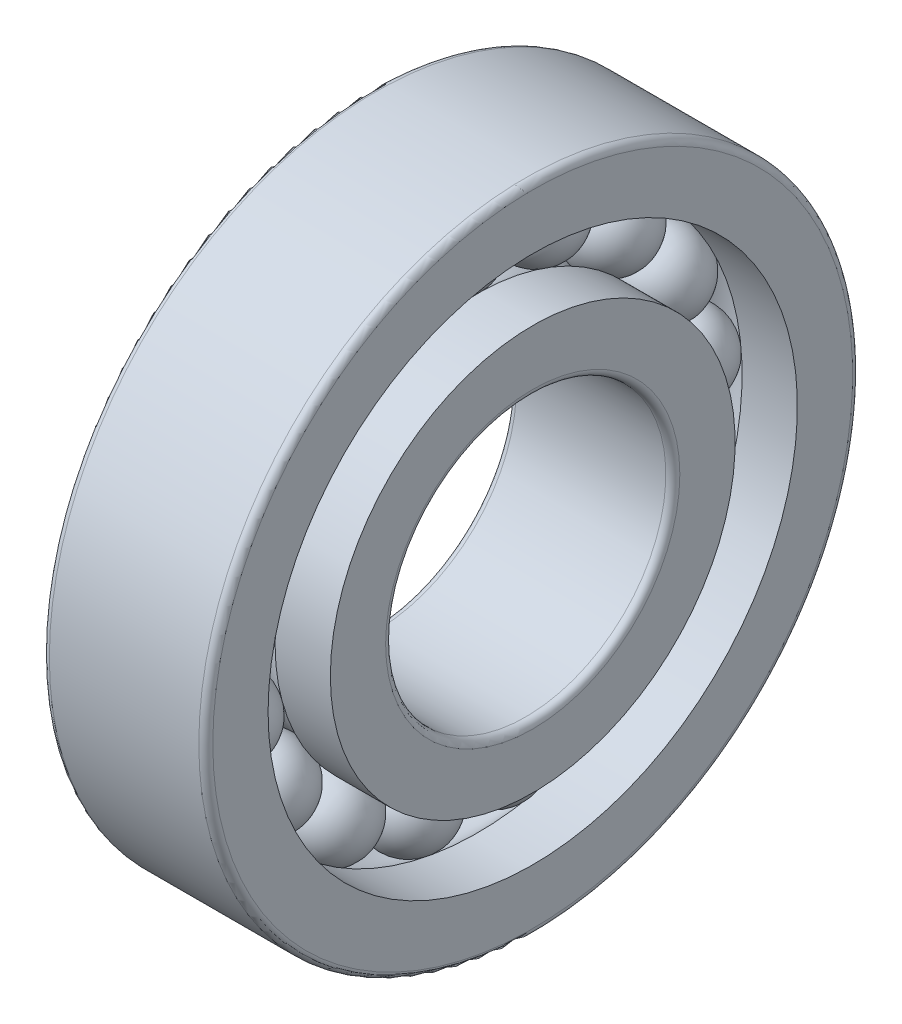
ISO-10303-21;
HEADER;
FILE_DESCRIPTION(('STEP AP214'),'2;1');
FILE_NAME('part.step','',(''),(''),'','','');
FILE_SCHEMA(('AUTOMOTIVE_DESIGN { 1 0 10303 214 1 1 1 1 }'));
ENDSEC;
DATA;
#1=APPLICATION_CONTEXT('core data for automotive mechanical design processes');
#2=APPLICATION_PROTOCOL_DEFINITION('international standard','automotive_design',2000,#1);
#3=PRODUCT_CONTEXT('',#1,'mechanical');
#4=PRODUCT('Part','Part','',(#3));
#5=PRODUCT_RELATED_PRODUCT_CATEGORY('part','',(#4));
#6=PRODUCT_DEFINITION_FORMATION('','',#4);
#7=PRODUCT_DEFINITION_CONTEXT('part definition',#1,'design');
#8=PRODUCT_DEFINITION('design','',#6,#7);
#9=PRODUCT_DEFINITION_SHAPE('','',#8);
#10=(LENGTH_UNIT() NAMED_UNIT(*) SI_UNIT(.MILLI.,.METRE.));
#11=(NAMED_UNIT(*) PLANE_ANGLE_UNIT() SI_UNIT($,.RADIAN.));
#12=(NAMED_UNIT(*) SI_UNIT($,.STERADIAN.) SOLID_ANGLE_UNIT());
#13=UNCERTAINTY_MEASURE_WITH_UNIT(LENGTH_MEASURE(1.E-05),#10,'distance_accuracy_value','');
#14=(GEOMETRIC_REPRESENTATION_CONTEXT(3) GLOBAL_UNCERTAINTY_ASSIGNED_CONTEXT((#13)) GLOBAL_UNIT_ASSIGNED_CONTEXT((#10,
#11,#12)) REPRESENTATION_CONTEXT('',''));
#15=CARTESIAN_POINT('',(0.,0.,0.));
#16=DIRECTION('',(0.,0.,1.));
#17=DIRECTION('',(1.,0.,0.));
#18=AXIS2_PLACEMENT_3D('',#15,#16,#17);
#19=CARTESIAN_POINT('',(0.,9.32472229404361,3.61241666187141));
#20=DIRECTION('',(-1.,0.,0.));
#21=DIRECTION('',(0.,-0.932472229404363,-0.361241666187134));
#22=AXIS2_PLACEMENT_3D('',#19,#20,#21);
#23=SPHERICAL_SURFACE('',#22,1.75);
#24=CARTESIAN_POINT('',(-1.75,9.32472229404361,3.61241666187141));
#25=VERTEX_POINT('',#24);
#26=VERTEX_LOOP('',#25);
#27=FACE_BOUND('',#26,.T.);
#28=ADVANCED_FACE('F47',(#27),#23,.T.);
#29=CLOSED_SHELL('',(#28));
#30=MANIFOLD_SOLID_BREP('B2',#29);
#31=CARTESIAN_POINT('',(0.,7.39008917220668,6.73695643646549));
#32=DIRECTION('',(-1.,0.,0.));
#33=DIRECTION('',(0.,-0.739008917220672,-0.673695643646543));
#34=AXIS2_PLACEMENT_3D('',#31,#32,#33);
#35=SPHERICAL_SURFACE('',#34,1.75);
#36=CARTESIAN_POINT('',(-1.75,7.39008917220668,6.73695643646549));
#37=VERTEX_POINT('',#36);
#38=VERTEX_LOOP('',#37);
#39=FACE_BOUND('',#38,.T.);
#40=ADVANCED_FACE('F69',(#39),#35,.T.);
#41=CLOSED_SHELL('',(#40));
#42=MANIFOLD_SOLID_BREP('B6',#41);
#43=CARTESIAN_POINT('',(0.,4.45738355776549,8.95163291355058));
#44=DIRECTION('',(-1.,0.,0.));
#45=DIRECTION('',(0.,-0.445738355776555,-0.895163291355054));
#46=AXIS2_PLACEMENT_3D('',#43,#44,#45);
#47=SPHERICAL_SURFACE('',#46,1.75);
#48=CARTESIAN_POINT('',(-1.75,4.45738355776549,8.95163291355058));
#49=VERTEX_POINT('',#48);
#50=VERTEX_LOOP('',#49);
#51=FACE_BOUND('',#50,.T.);
#52=ADVANCED_FACE('F91',(#51),#47,.T.);
#53=CLOSED_SHELL('',(#52));
#54=MANIFOLD_SOLID_BREP('B43',#53);
#55=CARTESIAN_POINT('',(0.,0.922683594633131,9.95734176295034));
#56=DIRECTION('',(-1.,0.,0.));
#57=DIRECTION('',(0.,-0.09226835946332,-0.995734176295033));
#58=AXIS2_PLACEMENT_3D('',#55,#56,#57);
#59=SPHERICAL_SURFACE('',#58,1.75);
#60=CARTESIAN_POINT('',(-1.75,0.922683594633131,9.95734176295034));
#61=VERTEX_POINT('',#60);
#62=VERTEX_LOOP('',#61);
#63=FACE_BOUND('',#62,.T.);
#64=ADVANCED_FACE('F113',(#63),#59,.T.);
#65=CLOSED_SHELL('',(#64));
#66=MANIFOLD_SOLID_BREP('B65',#65);
#67=CARTESIAN_POINT('',(0.,-2.73662990072073,9.61825643172823));
#68=DIRECTION('',(-1.,0.,0.));
#69=DIRECTION('',(0.,0.273662990072066,-0.961825643172824));
#70=AXIS2_PLACEMENT_3D('',#67,#68,#69);
#71=SPHERICAL_SURFACE('',#70,1.75);
#72=CARTESIAN_POINT('',(-1.75,-2.73662990072073,9.61825643172823));
#73=VERTEX_POINT('',#72);
#74=VERTEX_LOOP('',#73);
#75=FACE_BOUND('',#74,.T.);
#76=ADVANCED_FACE('F135',(#75),#71,.T.);
#77=CLOSED_SHELL('',(#76));
#78=MANIFOLD_SOLID_BREP('B87',#77);
#79=CARTESIAN_POINT('',(0.,-6.0263463637925,7.98017227280245));
#80=DIRECTION('',(-1.,0.,0.));
#81=DIRECTION('',(0.,0.602634636379244,-0.798017227280249));
#82=AXIS2_PLACEMENT_3D('',#79,#80,#81);
#83=SPHERICAL_SURFACE('',#82,1.75);
#84=CARTESIAN_POINT('',(-1.75,-6.0263463637925,7.98017227280245));
#85=VERTEX_POINT('',#84);
#86=VERTEX_LOOP('',#85);
#87=FACE_BOUND('',#86,.T.);
#88=ADVANCED_FACE('F157',(#87),#83,.T.);
#89=CLOSED_SHELL('',(#88));
#90=MANIFOLD_SOLID_BREP('B109',#89);
#91=CARTESIAN_POINT('',(0.,-8.50217135729611,5.26432162877363));
#92=DIRECTION('',(-1.,0.,0.));
#93=DIRECTION('',(0.,0.850217135729606,-0.526432162877369));
#94=AXIS2_PLACEMENT_3D('',#91,#92,#93);
#95=SPHERICAL_SURFACE('',#94,1.75);
#96=CARTESIAN_POINT('',(-1.75,-8.50217135729611,5.26432162877363));
#97=VERTEX_POINT('',#96);
#98=VERTEX_LOOP('',#97);
#99=FACE_BOUND('',#98,.T.);
#100=ADVANCED_FACE('F179',(#99),#95,.T.);
#101=CLOSED_SHELL('',(#100));
#102=MANIFOLD_SOLID_BREP('B131',#101);
#103=CARTESIAN_POINT('',(0.,-9.82973099683901,1.83749517816578));
#104=DIRECTION('',(-1.,0.,0.));
#105=DIRECTION('',(0.,0.982973099683899,-0.183749517816584));
#106=AXIS2_PLACEMENT_3D('',#103,#104,#105);
#107=SPHERICAL_SURFACE('',#106,1.75);
#108=CARTESIAN_POINT('',(-1.75,-9.82973099683901,1.83749517816578));
#109=VERTEX_POINT('',#108);
#110=VERTEX_LOOP('',#109);
#111=FACE_BOUND('',#110,.T.);
#112=ADVANCED_FACE('F201',(#111),#107,.T.);
#113=CLOSED_SHELL('',(#112));
#114=MANIFOLD_SOLID_BREP('B153',#113);
#115=CARTESIAN_POINT('',(0.,-9.82973099683904,-1.83749517816564));
#116=DIRECTION('',(-1.,0.,0.));
#117=DIRECTION('',(0.,0.982973099683904,0.183749517816557));
#118=AXIS2_PLACEMENT_3D('',#115,#116,#117);
#119=SPHERICAL_SURFACE('',#118,1.75);
#120=CARTESIAN_POINT('',(-1.75,-9.82973099683904,-1.83749517816564));
#121=VERTEX_POINT('',#120);
#122=VERTEX_LOOP('',#121);
#123=FACE_BOUND('',#122,.T.);
#124=ADVANCED_FACE('F223',(#123),#119,.T.);
#125=CLOSED_SHELL('',(#124));
#126=MANIFOLD_SOLID_BREP('B175',#125);
#127=CARTESIAN_POINT('',(0.,-8.50217135729618,-5.26432162877351));
#128=DIRECTION('',(-1.,0.,0.));
#129=DIRECTION('',(0.,0.850217135729621,0.526432162877345));
#130=AXIS2_PLACEMENT_3D('',#127,#128,#129);
#131=SPHERICAL_SURFACE('',#130,1.75);
#132=CARTESIAN_POINT('',(-1.75,-8.50217135729618,-5.26432162877351));
#133=VERTEX_POINT('',#132);
#134=VERTEX_LOOP('',#133);
#135=FACE_BOUND('',#134,.T.);
#136=ADVANCED_FACE('F245',(#135),#131,.T.);
#137=CLOSED_SHELL('',(#136));
#138=MANIFOLD_SOLID_BREP('B197',#137);
#139=CARTESIAN_POINT('',(0.,-6.02634636379261,-7.98017227280237));
#140=DIRECTION('',(-1.,0.,0.));
#141=DIRECTION('',(0.,0.602634636379266,0.798017227280232));
#142=AXIS2_PLACEMENT_3D('',#139,#140,#141);
#143=SPHERICAL_SURFACE('',#142,1.75);
#144=CARTESIAN_POINT('',(-1.75,-6.02634636379261,-7.98017227280237));
#145=VERTEX_POINT('',#144);
#146=VERTEX_LOOP('',#145);
#147=FACE_BOUND('',#146,.T.);
#148=ADVANCED_FACE('F267',(#147),#143,.T.);
#149=CLOSED_SHELL('',(#148));
#150=MANIFOLD_SOLID_BREP('B219',#149);
#151=CARTESIAN_POINT('',(0.,-2.73662990072087,-9.61825643172819));
#152=DIRECTION('',(-1.,0.,0.));
#153=DIRECTION('',(0.,0.273662990072093,0.961825643172816));
#154=AXIS2_PLACEMENT_3D('',#151,#152,#153);
#155=SPHERICAL_SURFACE('',#154,1.75);
#156=CARTESIAN_POINT('',(-1.75,-2.73662990072087,-9.61825643172819));
#157=VERTEX_POINT('',#156);
#158=VERTEX_LOOP('',#157);
#159=FACE_BOUND('',#158,.T.);
#160=ADVANCED_FACE('F289',(#159),#155,.T.);
#161=CLOSED_SHELL('',(#160));
#162=MANIFOLD_SOLID_BREP('B241',#161);
#163=CARTESIAN_POINT('',(0.,0.922683594632988,-9.95734176295036));
#164=DIRECTION('',(-1.,0.,0.));
#165=DIRECTION('',(0.,-0.0922683594632918,0.995734176295036));
#166=AXIS2_PLACEMENT_3D('',#163,#164,#165);
#167=SPHERICAL_SURFACE('',#166,1.75);
#168=CARTESIAN_POINT('',(-1.75,0.922683594632988,-9.95734176295036));
#169=VERTEX_POINT('',#168);
#170=VERTEX_LOOP('',#169);
#171=FACE_BOUND('',#170,.T.);
#172=ADVANCED_FACE('F311',(#171),#167,.T.);
#173=CLOSED_SHELL('',(#172));
#174=MANIFOLD_SOLID_BREP('B263',#173);
#175=CARTESIAN_POINT('',(0.,4.45738355776536,-8.95163291355064));
#176=DIRECTION('',(-1.,0.,0.));
#177=DIRECTION('',(0.,-0.44573835577653,0.895163291355067));
#178=AXIS2_PLACEMENT_3D('',#175,#176,#177);
#179=SPHERICAL_SURFACE('',#178,1.75);
#180=CARTESIAN_POINT('',(-1.75,4.45738355776536,-8.95163291355064));
#181=VERTEX_POINT('',#180);
#182=VERTEX_LOOP('',#181);
#183=FACE_BOUND('',#182,.T.);
#184=ADVANCED_FACE('F333',(#183),#179,.T.);
#185=CLOSED_SHELL('',(#184));
#186=MANIFOLD_SOLID_BREP('B285',#185);
#187=CARTESIAN_POINT('',(0.,7.39008917220659,-6.73695643646559));
#188=DIRECTION('',(-1.,0.,0.));
#189=DIRECTION('',(0.,-0.739008917220653,0.673695643646564));
#190=AXIS2_PLACEMENT_3D('',#187,#188,#189);
#191=SPHERICAL_SURFACE('',#190,1.75);
#192=CARTESIAN_POINT('',(-1.75,7.39008917220659,-6.73695643646559));
#193=VERTEX_POINT('',#192);
#194=VERTEX_LOOP('',#193);
#195=FACE_BOUND('',#194,.T.);
#196=ADVANCED_FACE('F355',(#195),#191,.T.);
#197=CLOSED_SHELL('',(#196));
#198=MANIFOLD_SOLID_BREP('B307',#197);
#199=CARTESIAN_POINT('',(0.,9.32472229404356,-3.61241666187154));
#200=DIRECTION('',(-1.,0.,0.));
#201=DIRECTION('',(0.,-0.932472229404353,0.36124166618716));
#202=AXIS2_PLACEMENT_3D('',#199,#200,#201);
#203=SPHERICAL_SURFACE('',#202,1.75);
#204=CARTESIAN_POINT('',(-1.75,9.32472229404356,-3.61241666187154));
#205=VERTEX_POINT('',#204);
#206=VERTEX_LOOP('',#205);
#207=FACE_BOUND('',#206,.T.);
#208=ADVANCED_FACE('F379',(#207),#203,.T.);
#209=CLOSED_SHELL('',(#208));
#210=MANIFOLD_SOLID_BREP('B329',#209);
#211=CARTESIAN_POINT('',(-3.05000000000011,0.,0.));
#212=DIRECTION('',(1.,0.,0.));
#213=DIRECTION('',(0.,0.,-1.));
#214=AXIS2_PLACEMENT_3D('',#211,#212,#213);
#215=CONICAL_SURFACE('',#214,11.6333333333334,0.785398163397541);
#216=CARTESIAN_POINT('',(-3.35000000000005,0.,0.));
#217=DIRECTION('',(-1.,0.,0.));
#218=DIRECTION('',(0.,0.,1.));
#219=AXIS2_PLACEMENT_3D('',#216,#217,#218);
#220=CIRCLE('',#219,11.3333333333334);
#221=CARTESIAN_POINT('',(-3.35000000000005,0.,11.3333333333334));
#222=VERTEX_POINT('',#221);
#223=EDGE_CURVE('E378',#222,#222,#220,.T.);
#224=ORIENTED_EDGE('',*,*,#223,.F.);
#225=EDGE_LOOP('',(#224));
#226=FACE_BOUND('',#225,.T.);
#227=CARTESIAN_POINT('',(-3.05000000000011,0.,0.));
#228=DIRECTION('',(-1.,0.,0.));
#229=DIRECTION('',(0.,0.,1.));
#230=AXIS2_PLACEMENT_3D('',#227,#228,#229);
#231=CIRCLE('',#230,11.6333333333334);
#232=CARTESIAN_POINT('',(-3.05000000000011,0.,11.6333333333334));
#233=VERTEX_POINT('',#232);
#234=EDGE_CURVE('E435',#233,#233,#231,.T.);
#235=ORIENTED_EDGE('',*,*,#234,.T.);
#236=EDGE_LOOP('',(#235));
#237=FACE_BOUND('',#236,.T.);
#238=ADVANCED_FACE('F401',(#226,#237),#215,.T.);
#239=CARTESIAN_POINT('',(-3.35000000000005,-11.3333333333334,0.));
#240=DIRECTION('',(1.,0.,0.));
#241=DIRECTION('',(0.,0.,-1.));
#242=AXIS2_PLACEMENT_3D('',#239,#240,#241);
#243=PLANE('',#242);
#244=CARTESIAN_POINT('',(-3.35000000000005,0.,0.));
#245=DIRECTION('',(-1.,0.,0.));
#246=DIRECTION('',(0.,0.,1.));
#247=AXIS2_PLACEMENT_3D('',#244,#245,#246);
#248=CIRCLE('',#247,8.66666666666666);
#249=CARTESIAN_POINT('',(-3.35000000000005,0.,8.66666666666666));
#250=VERTEX_POINT('',#249);
#251=EDGE_CURVE('E407',#250,#250,#248,.T.);
#252=ORIENTED_EDGE('',*,*,#251,.F.);
#253=EDGE_LOOP('',(#252));
#254=FACE_BOUND('',#253,.T.);
#255=ORIENTED_EDGE('',*,*,#223,.T.);
#256=EDGE_LOOP('',(#255));
#257=FACE_BOUND('',#256,.T.);
#258=ADVANCED_FACE('F484',(#254,#257),#243,.F.);
#259=CARTESIAN_POINT('',(-3.35000000000005,0.,0.));
#260=DIRECTION('',(-1.,0.,0.));
#261=DIRECTION('',(0.,0.,1.));
#262=AXIS2_PLACEMENT_3D('',#259,#260,#261);
#263=CONICAL_SURFACE('',#262,8.66666666666666,0.785398163397454);
#264=CARTESIAN_POINT('',(-3.05000000000006,0.,0.));
#265=DIRECTION('',(-1.,0.,0.));
#266=DIRECTION('',(0.,0.,1.));
#267=AXIS2_PLACEMENT_3D('',#264,#265,#266);
#268=CIRCLE('',#267,8.36666666666666);
#269=CARTESIAN_POINT('',(-3.05000000000006,0.,8.36666666666666));
#270=VERTEX_POINT('',#269);
#271=EDGE_CURVE('E411',#270,#270,#268,.T.);
#272=ORIENTED_EDGE('',*,*,#271,.F.);
#273=EDGE_LOOP('',(#272));
#274=FACE_BOUND('',#273,.T.);
#275=ORIENTED_EDGE('',*,*,#251,.T.);
#276=EDGE_LOOP('',(#275));
#277=FACE_BOUND('',#276,.T.);
#278=ADVANCED_FACE('F479',(#274,#277),#263,.F.);
#279=CARTESIAN_POINT('',(-19.9270921924268,0.,0.));
#280=DIRECTION('',(-1.,0.,0.));
#281=DIRECTION('',(0.,0.,1.));
#282=AXIS2_PLACEMENT_3D('',#279,#280,#281);
#283=CYLINDRICAL_SURFACE('',#282,8.36666666666665);
#284=CARTESIAN_POINT('',(-2.75000000000011,0.,0.));
#285=DIRECTION('',(-1.,0.,0.));
#286=DIRECTION('',(0.,0.,1.));
#287=AXIS2_PLACEMENT_3D('',#284,#285,#286);
#288=CIRCLE('',#287,8.36666666666665);
#289=CARTESIAN_POINT('',(-2.75000000000011,0.,8.36666666666665));
#290=VERTEX_POINT('',#289);
#291=EDGE_CURVE('E415',#290,#290,#288,.T.);
#292=ORIENTED_EDGE('',*,*,#291,.F.);
#293=EDGE_LOOP('',(#292));
#294=FACE_BOUND('',#293,.T.);
#295=ORIENTED_EDGE('',*,*,#271,.T.);
#296=EDGE_LOOP('',(#295));
#297=FACE_BOUND('',#296,.T.);
#298=ADVANCED_FACE('F473',(#294,#297),#283,.F.);
#299=CARTESIAN_POINT('',(-2.75000000000011,-8.66666666666666,0.));
#300=DIRECTION('',(-1.,0.,0.));
#301=DIRECTION('',(0.,0.,1.));
#302=AXIS2_PLACEMENT_3D('',#299,#300,#301);
#303=PLANE('',#302);
#304=CARTESIAN_POINT('',(-2.75000000000011,0.,0.));
#305=DIRECTION('',(-1.,0.,0.));
#306=DIRECTION('',(0.,0.,1.));
#307=AXIS2_PLACEMENT_3D('',#304,#305,#306);
#308=CIRCLE('',#307,8.66666666666666);
#309=CARTESIAN_POINT('',(-2.75000000000011,0.,8.66666666666666));
#310=VERTEX_POINT('',#309);
#311=EDGE_CURVE('E420',#310,#310,#308,.T.);
#312=ORIENTED_EDGE('',*,*,#311,.F.);
#313=EDGE_LOOP('',(#312));
#314=FACE_BOUND('',#313,.T.);
#315=ORIENTED_EDGE('',*,*,#291,.T.);
#316=EDGE_LOOP('',(#315));
#317=FACE_BOUND('',#316,.T.);
#318=ADVANCED_FACE('F467',(#314,#317),#303,.F.);
#319=CARTESIAN_POINT('',(-2.75000000000011,0.,0.));
#320=DIRECTION('',(-1.,0.,0.));
#321=DIRECTION('',(0.,0.,1.));
#322=AXIS2_PLACEMENT_3D('',#319,#320,#321);
#323=CONICAL_SURFACE('',#322,8.66666666666666,0.785398163397437);
#324=CARTESIAN_POINT('',(-3.05000000000004,0.,0.));
#325=DIRECTION('',(-1.,0.,0.));
#326=DIRECTION('',(0.,0.,1.));
#327=AXIS2_PLACEMENT_3D('',#324,#325,#326);
#328=CIRCLE('',#327,8.96666666666658);
#329=CARTESIAN_POINT('',(-3.05000000000004,0.,8.96666666666658));
#330=VERTEX_POINT('',#329);
#331=EDGE_CURVE('E423',#330,#330,#328,.T.);
#332=ORIENTED_EDGE('',*,*,#331,.F.);
#333=EDGE_LOOP('',(#332));
#334=FACE_BOUND('',#333,.T.);
#335=ORIENTED_EDGE('',*,*,#311,.T.);
#336=EDGE_LOOP('',(#335));
#337=FACE_BOUND('',#336,.T.);
#338=ADVANCED_FACE('F461',(#334,#337),#323,.T.);
#339=CARTESIAN_POINT('',(-3.05000000000004,-11.0333333333334,0.));
#340=DIRECTION('',(-1.,0.,0.));
#341=DIRECTION('',(0.,0.,1.));
#342=AXIS2_PLACEMENT_3D('',#339,#340,#341);
#343=PLANE('',#342);
#344=CARTESIAN_POINT('',(-3.05000000000004,0.,0.));
#345=DIRECTION('',(-1.,0.,0.));
#346=DIRECTION('',(0.,0.,1.));
#347=AXIS2_PLACEMENT_3D('',#344,#345,#346);
#348=CIRCLE('',#347,11.0333333333334);
#349=CARTESIAN_POINT('',(-3.05000000000004,0.,11.0333333333334));
#350=VERTEX_POINT('',#349);
#351=EDGE_CURVE('E426',#350,#350,#348,.T.);
#352=ORIENTED_EDGE('',*,*,#351,.F.);
#353=EDGE_LOOP('',(#352));
#354=FACE_BOUND('',#353,.T.);
#355=ORIENTED_EDGE('',*,*,#331,.T.);
#356=EDGE_LOOP('',(#355));
#357=FACE_BOUND('',#356,.T.);
#358=ADVANCED_FACE('F455',(#354,#357),#343,.F.);
#359=CARTESIAN_POINT('',(-3.05000000000004,0.,0.));
#360=DIRECTION('',(1.,0.,0.));
#361=DIRECTION('',(0.,0.,-1.));
#362=AXIS2_PLACEMENT_3D('',#359,#360,#361);
#363=CONICAL_SURFACE('',#362,11.0333333333334,0.78539816339746);
#364=CARTESIAN_POINT('',(-2.75000000000011,0.,0.));
#365=DIRECTION('',(-1.,0.,0.));
#366=DIRECTION('',(0.,0.,1.));
#367=AXIS2_PLACEMENT_3D('',#364,#365,#366);
#368=CIRCLE('',#367,11.3333333333334);
#369=CARTESIAN_POINT('',(-2.75000000000011,0.,11.3333333333334));
#370=VERTEX_POINT('',#369);
#371=EDGE_CURVE('E429',#370,#370,#368,.T.);
#372=ORIENTED_EDGE('',*,*,#371,.F.);
#373=EDGE_LOOP('',(#372));
#374=FACE_BOUND('',#373,.T.);
#375=ORIENTED_EDGE('',*,*,#351,.T.);
#376=EDGE_LOOP('',(#375));
#377=FACE_BOUND('',#376,.T.);
#378=ADVANCED_FACE('F449',(#374,#377),#363,.F.);
#379=CARTESIAN_POINT('',(-2.75000000000011,-11.6333333333334,0.));
#380=DIRECTION('',(-1.,0.,0.));
#381=DIRECTION('',(0.,0.,1.));
#382=AXIS2_PLACEMENT_3D('',#379,#380,#381);
#383=PLANE('',#382);
#384=CARTESIAN_POINT('',(-2.75000000000011,0.,0.));
#385=DIRECTION('',(-1.,0.,0.));
#386=DIRECTION('',(0.,0.,1.));
#387=AXIS2_PLACEMENT_3D('',#384,#385,#386);
#388=CIRCLE('',#387,11.6333333333334);
#389=CARTESIAN_POINT('',(-2.75000000000011,0.,11.6333333333334));
#390=VERTEX_POINT('',#389);
#391=EDGE_CURVE('E432',#390,#390,#388,.T.);
#392=ORIENTED_EDGE('',*,*,#391,.F.);
#393=EDGE_LOOP('',(#392));
#394=FACE_BOUND('',#393,.T.);
#395=ORIENTED_EDGE('',*,*,#371,.T.);
#396=EDGE_LOOP('',(#395));
#397=FACE_BOUND('',#396,.T.);
#398=ADVANCED_FACE('F443',(#394,#397),#383,.F.);
#399=CARTESIAN_POINT('',(-19.9270921924268,0.,0.));
#400=DIRECTION('',(-1.,0.,0.));
#401=DIRECTION('',(0.,0.,1.));
#402=AXIS2_PLACEMENT_3D('',#399,#400,#401);
#403=CYLINDRICAL_SURFACE('',#402,11.6333333333334);
#404=ORIENTED_EDGE('',*,*,#234,.F.);
#405=EDGE_LOOP('',(#404));
#406=FACE_BOUND('',#405,.T.);
#407=ORIENTED_EDGE('',*,*,#391,.T.);
#408=EDGE_LOOP('',(#407));
#409=FACE_BOUND('',#408,.T.);
#410=ADVANCED_FACE('F440',(#406,#409),#403,.T.);
#411=CLOSED_SHELL('',(#238,#258,#278,#298,#318,#338,#358,#378,#398,#410));
#412=MANIFOLD_SOLID_BREP('B351',#411);
#413=CARTESIAN_POINT('',(0.,10.,0.));
#414=DIRECTION('',(-1.,0.,0.));
#415=DIRECTION('',(0.,-1.,0.));
#416=AXIS2_PLACEMENT_3D('',#413,#414,#415);
#417=SPHERICAL_SURFACE('',#416,1.75);
#418=CARTESIAN_POINT('',(-1.75,10.,0.));
#419=VERTEX_POINT('',#418);
#420=VERTEX_LOOP('',#419);
#421=FACE_BOUND('',#420,.T.);
#422=ADVANCED_FACE('F600',(#421),#417,.T.);
#423=CLOSED_SHELL('',(#422));
#424=MANIFOLD_SOLID_BREP('B373',#423);
#425=CARTESIAN_POINT('',(-3.50000000000003,6.30000000000001,0.));
#426=DIRECTION('',(1.,0.,0.));
#427=DIRECTION('',(0.,0.,-1.));
#428=AXIS2_PLACEMENT_3D('',#425,#426,#427);
#429=PLANE('',#428);
#430=CARTESIAN_POINT('',(-3.50000000000003,0.,0.));
#431=DIRECTION('',(-1.,0.,0.));
#432=DIRECTION('',(0.,0.,1.));
#433=AXIS2_PLACEMENT_3D('',#430,#431,#432);
#434=CIRCLE('',#433,6.30000000000001);
#435=CARTESIAN_POINT('',(-3.50000000000003,0.,6.30000000000001));
#436=VERTEX_POINT('',#435);
#437=EDGE_CURVE('E599',#436,#436,#434,.T.);
#438=ORIENTED_EDGE('',*,*,#437,.F.);
#439=EDGE_LOOP('',(#438));
#440=FACE_BOUND('',#439,.T.);
#441=CARTESIAN_POINT('',(-3.50000000000003,0.,0.));
#442=DIRECTION('',(-1.,0.,0.));
#443=DIRECTION('',(0.,0.,1.));
#444=AXIS2_PLACEMENT_3D('',#441,#442,#443);
#445=CIRCLE('',#444,8.66666666666666);
#446=CARTESIAN_POINT('',(-3.50000000000003,0.,8.66666666666666));
#447=VERTEX_POINT('',#446);
#448=EDGE_CURVE('E659',#447,#447,#445,.T.);
#449=ORIENTED_EDGE('',*,*,#448,.T.);
#450=EDGE_LOOP('',(#449));
#451=FACE_BOUND('',#450,.T.);
#452=ADVANCED_FACE('F619',(#440,#451),#429,.F.);
#453=CARTESIAN_POINT('',(-3.20000000000003,0.,0.));
#454=DIRECTION('',(-1.,0.,0.));
#455=DIRECTION('',(0.,0.,1.));
#456=AXIS2_PLACEMENT_3D('',#453,#454,#455);
#457=TOROIDAL_SURFACE('',#456,6.30000000000001,0.3);
#458=CARTESIAN_POINT('',(-3.20000000000003,0.,0.));
#459=DIRECTION('',(-1.,0.,0.));
#460=DIRECTION('',(0.,0.,1.));
#461=AXIS2_PLACEMENT_3D('',#458,#459,#460);
#462=CIRCLE('',#461,6.00000000000001);
#463=CARTESIAN_POINT('',(-3.20000000000003,0.,6.00000000000001));
#464=VERTEX_POINT('',#463);
#465=EDGE_CURVE('E625',#464,#464,#462,.T.);
#466=ORIENTED_EDGE('',*,*,#465,.F.);
#467=EDGE_LOOP('',(#466));
#468=FACE_BOUND('',#467,.T.);
#469=ORIENTED_EDGE('',*,*,#437,.T.);
#470=EDGE_LOOP('',(#469));
#471=FACE_BOUND('',#470,.T.);
#472=ADVANCED_FACE('F720',(#468,#471),#457,.T.);
#473=CARTESIAN_POINT('',(-3.5,0.,0.));
#474=DIRECTION('',(-1.,0.,0.));
#475=DIRECTION('',(0.,0.,1.));
#476=AXIS2_PLACEMENT_3D('',#473,#474,#475);
#477=CYLINDRICAL_SURFACE('',#476,6.00000000000001);
#478=CARTESIAN_POINT('',(3.19999999999996,0.,0.));
#479=DIRECTION('',(-1.,0.,0.));
#480=DIRECTION('',(0.,0.,1.));
#481=AXIS2_PLACEMENT_3D('',#478,#479,#480);
#482=CIRCLE('',#481,6.00000000000001);
#483=CARTESIAN_POINT('',(3.19999999999996,0.,6.00000000000001));
#484=VERTEX_POINT('',#483);
#485=EDGE_CURVE('E629',#484,#484,#482,.T.);
#486=ORIENTED_EDGE('',*,*,#485,.F.);
#487=EDGE_LOOP('',(#486));
#488=FACE_BOUND('',#487,.T.);
#489=ORIENTED_EDGE('',*,*,#465,.T.);
#490=EDGE_LOOP('',(#489));
#491=FACE_BOUND('',#490,.T.);
#492=ADVANCED_FACE('F715',(#488,#491),#477,.F.);
#493=CARTESIAN_POINT('',(3.19999999999996,0.,0.));
#494=DIRECTION('',(-1.,0.,0.));
#495=DIRECTION('',(0.,0.,1.));
#496=AXIS2_PLACEMENT_3D('',#493,#494,#495);
#497=TOROIDAL_SURFACE('',#496,6.30000000000001,0.300000000000002);
#498=CARTESIAN_POINT('',(3.49999999999996,0.,0.));
#499=DIRECTION('',(-1.,0.,0.));
#500=DIRECTION('',(0.,0.,1.));
#501=AXIS2_PLACEMENT_3D('',#498,#499,#500);
#502=CIRCLE('',#501,6.3);
#503=CARTESIAN_POINT('',(3.49999999999996,0.,6.3));
#504=VERTEX_POINT('',#503);
#505=EDGE_CURVE('E633',#504,#504,#502,.T.);
#506=ORIENTED_EDGE('',*,*,#505,.F.);
#507=EDGE_LOOP('',(#506));
#508=FACE_BOUND('',#507,.T.);
#509=ORIENTED_EDGE('',*,*,#485,.T.);
#510=EDGE_LOOP('',(#509));
#511=FACE_BOUND('',#510,.T.);
#512=ADVANCED_FACE('F709',(#508,#511),#497,.T.);
#513=CARTESIAN_POINT('',(3.49999999999999,8.66666666666666,0.));
#514=DIRECTION('',(-1.,0.,0.));
#515=DIRECTION('',(0.,0.,1.));
#516=AXIS2_PLACEMENT_3D('',#513,#514,#515);
#517=PLANE('',#516);
#518=CARTESIAN_POINT('',(3.50000000000002,0.,0.));
#519=DIRECTION('',(-1.,0.,0.));
#520=DIRECTION('',(0.,0.,1.));
#521=AXIS2_PLACEMENT_3D('',#518,#519,#520);
#522=CIRCLE('',#521,8.66666666666666);
#523=CARTESIAN_POINT('',(3.50000000000002,0.,8.66666666666666));
#524=VERTEX_POINT('',#523);
#525=EDGE_CURVE('E638',#524,#524,#522,.T.);
#526=ORIENTED_EDGE('',*,*,#525,.F.);
#527=EDGE_LOOP('',(#526));
#528=FACE_BOUND('',#527,.T.);
#529=ORIENTED_EDGE('',*,*,#505,.T.);
#530=EDGE_LOOP('',(#529));
#531=FACE_BOUND('',#530,.T.);
#532=ADVANCED_FACE('F703',(#528,#531),#517,.F.);
#533=CARTESIAN_POINT('',(-3.5,0.,0.));
#534=DIRECTION('',(-1.,0.,0.));
#535=DIRECTION('',(0.,0.,1.));
#536=AXIS2_PLACEMENT_3D('',#533,#534,#535);
#537=CYLINDRICAL_SURFACE('',#536,8.66666666666666);
#538=CARTESIAN_POINT('',(1.13345587572793,0.,0.));
#539=DIRECTION('',(-1.,0.,0.));
#540=DIRECTION('',(0.,0.,1.));
#541=AXIS2_PLACEMENT_3D('',#538,#539,#540);
#542=CIRCLE('',#541,8.66666666666666);
#543=CARTESIAN_POINT('',(1.13345587572793,0.,8.66666666666666));
#544=VERTEX_POINT('',#543);
#545=EDGE_CURVE('E641',#544,#544,#542,.T.);
#546=ORIENTED_EDGE('',*,*,#545,.F.);
#547=EDGE_LOOP('',(#546));
#548=FACE_BOUND('',#547,.T.);
#549=ORIENTED_EDGE('',*,*,#525,.T.);
#550=EDGE_LOOP('',(#549));
#551=FACE_BOUND('',#550,.T.);
#552=ADVANCED_FACE('F697',(#548,#551),#537,.T.);
#553=CARTESIAN_POINT('',(0.,0.,0.));
#554=DIRECTION('',(-1.,0.,0.));
#555=DIRECTION('',(0.,0.,1.));
#556=AXIS2_PLACEMENT_3D('',#553,#554,#555);
#557=TOROIDAL_SURFACE('',#556,10.,1.75);
#558=CARTESIAN_POINT('',(-1.13345587572793,0.,0.));
#559=DIRECTION('',(-1.,0.,0.));
#560=DIRECTION('',(0.,0.,1.));
#561=AXIS2_PLACEMENT_3D('',#558,#559,#560);
#562=CIRCLE('',#561,8.66666666666666);
#563=CARTESIAN_POINT('',(-1.13345587572793,0.,8.66666666666666));
#564=VERTEX_POINT('',#563);
#565=EDGE_CURVE('E644',#564,#564,#562,.T.);
#566=ORIENTED_EDGE('',*,*,#565,.F.);
#567=EDGE_LOOP('',(#566));
#568=FACE_BOUND('',#567,.T.);
#569=ORIENTED_EDGE('',*,*,#545,.T.);
#570=EDGE_LOOP('',(#569));
#571=FACE_BOUND('',#570,.T.);
#572=ADVANCED_FACE('F691',(#568,#571),#557,.F.);
#573=CARTESIAN_POINT('',(-3.5,0.,0.));
#574=DIRECTION('',(-1.,0.,0.));
#575=DIRECTION('',(0.,0.,1.));
#576=AXIS2_PLACEMENT_3D('',#573,#574,#575);
#577=CYLINDRICAL_SURFACE('',#576,8.66666666666666);
#578=CARTESIAN_POINT('',(-2.75000000000011,0.,0.));
#579=DIRECTION('',(-1.,0.,0.));
#580=DIRECTION('',(0.,0.,1.));
#581=AXIS2_PLACEMENT_3D('',#578,#579,#580);
#582=CIRCLE('',#581,8.66666666666666);
#583=CARTESIAN_POINT('',(-2.75000000000011,0.,8.66666666666666));
#584=VERTEX_POINT('',#583);
#585=EDGE_CURVE('E647',#584,#584,#582,.T.);
#586=ORIENTED_EDGE('',*,*,#585,.F.);
#587=EDGE_LOOP('',(#586));
#588=FACE_BOUND('',#587,.T.);
#589=ORIENTED_EDGE('',*,*,#565,.T.);
#590=EDGE_LOOP('',(#589));
#591=FACE_BOUND('',#590,.T.);
#592=ADVANCED_FACE('F685',(#588,#591),#577,.T.);
#593=CARTESIAN_POINT('',(-2.75000000000011,8.66666666666666,0.));
#594=DIRECTION('',(1.,0.,0.));
#595=DIRECTION('',(0.,0.,-1.));
#596=AXIS2_PLACEMENT_3D('',#593,#594,#595);
#597=PLANE('',#596);
#598=CARTESIAN_POINT('',(-2.75000000000011,0.,0.));
#599=DIRECTION('',(-1.,0.,0.));
#600=DIRECTION('',(0.,0.,1.));
#601=AXIS2_PLACEMENT_3D('',#598,#599,#600);
#602=CIRCLE('',#601,8.36666666666665);
#603=CARTESIAN_POINT('',(-2.75000000000011,0.,8.36666666666665));
#604=VERTEX_POINT('',#603);
#605=EDGE_CURVE('E650',#604,#604,#602,.T.);
#606=ORIENTED_EDGE('',*,*,#605,.F.);
#607=EDGE_LOOP('',(#606));
#608=FACE_BOUND('',#607,.T.);
#609=ORIENTED_EDGE('',*,*,#585,.T.);
#610=EDGE_LOOP('',(#609));
#611=FACE_BOUND('',#610,.T.);
#612=ADVANCED_FACE('F679',(#608,#611),#597,.F.);
#613=CARTESIAN_POINT('',(-3.5,0.,0.));
#614=DIRECTION('',(-1.,0.,0.));
#615=DIRECTION('',(0.,0.,1.));
#616=AXIS2_PLACEMENT_3D('',#613,#614,#615);
#617=CYLINDRICAL_SURFACE('',#616,8.36666666666665);
#618=CARTESIAN_POINT('',(-3.05000000000006,0.,0.));
#619=DIRECTION('',(-1.,0.,0.));
#620=DIRECTION('',(0.,0.,1.));
#621=AXIS2_PLACEMENT_3D('',#618,#619,#620);
#622=CIRCLE('',#621,8.36666666666666);
#623=CARTESIAN_POINT('',(-3.05000000000006,0.,8.36666666666666));
#624=VERTEX_POINT('',#623);
#625=EDGE_CURVE('E653',#624,#624,#622,.T.);
#626=ORIENTED_EDGE('',*,*,#625,.F.);
#627=EDGE_LOOP('',(#626));
#628=FACE_BOUND('',#627,.T.);
#629=ORIENTED_EDGE('',*,*,#605,.T.);
#630=EDGE_LOOP('',(#629));
#631=FACE_BOUND('',#630,.T.);
#632=ADVANCED_FACE('F673',(#628,#631),#617,.T.);
#633=CARTESIAN_POINT('',(-3.05000000000006,0.,0.));
#634=DIRECTION('',(-1.,0.,0.));
#635=DIRECTION('',(0.,0.,1.));
#636=AXIS2_PLACEMENT_3D('',#633,#634,#635);
#637=CONICAL_SURFACE('',#636,8.36666666666666,0.785398163397454);
#638=CARTESIAN_POINT('',(-3.35000000000005,0.,0.));
#639=DIRECTION('',(-1.,0.,0.));
#640=DIRECTION('',(0.,0.,1.));
#641=AXIS2_PLACEMENT_3D('',#638,#639,#640);
#642=CIRCLE('',#641,8.66666666666666);
#643=CARTESIAN_POINT('',(-3.35000000000005,0.,8.66666666666666));
#644=VERTEX_POINT('',#643);
#645=EDGE_CURVE('E656',#644,#644,#642,.T.);
#646=ORIENTED_EDGE('',*,*,#645,.F.);
#647=EDGE_LOOP('',(#646));
#648=FACE_BOUND('',#647,.T.);
#649=ORIENTED_EDGE('',*,*,#625,.T.);
#650=EDGE_LOOP('',(#649));
#651=FACE_BOUND('',#650,.T.);
#652=ADVANCED_FACE('F667',(#648,#651),#637,.T.);
#653=CARTESIAN_POINT('',(-3.5,0.,0.));
#654=DIRECTION('',(-1.,0.,0.));
#655=DIRECTION('',(0.,0.,1.));
#656=AXIS2_PLACEMENT_3D('',#653,#654,#655);
#657=CYLINDRICAL_SURFACE('',#656,8.66666666666666);
#658=ORIENTED_EDGE('',*,*,#448,.F.);
#659=EDGE_LOOP('',(#658));
#660=FACE_BOUND('',#659,.T.);
#661=ORIENTED_EDGE('',*,*,#645,.T.);
#662=EDGE_LOOP('',(#661));
#663=FACE_BOUND('',#662,.T.);
#664=ADVANCED_FACE('F664',(#660,#663),#657,.T.);
#665=CLOSED_SHELL('',(#452,#472,#492,#512,#532,#552,#572,#592,#612,#632,#652,#664));
#666=MANIFOLD_SOLID_BREP('B397',#665);
#667=CARTESIAN_POINT('',(-3.20000000000003,0.,0.));
#668=DIRECTION('',(-1.,0.,0.));
#669=DIRECTION('',(0.,0.,1.));
#670=AXIS2_PLACEMENT_3D('',#667,#668,#669);
#671=TOROIDAL_SURFACE('',#670,13.7,0.300000000000005);
#672=CARTESIAN_POINT('',(-3.50000000000003,0.,0.));
#673=DIRECTION('',(-1.,0.,0.));
#674=DIRECTION('',(0.,0.,1.));
#675=AXIS2_PLACEMENT_3D('',#672,#673,#674);
#676=CIRCLE('',#675,13.7);
#677=CARTESIAN_POINT('',(-3.50000000000003,0.,13.7));
#678=VERTEX_POINT('',#677);
#679=EDGE_CURVE('E618',#678,#678,#676,.T.);
#680=ORIENTED_EDGE('',*,*,#679,.F.);
#681=EDGE_LOOP('',(#680));
#682=FACE_BOUND('',#681,.T.);
#683=CARTESIAN_POINT('',(-3.20000000000003,0.,0.));
#684=DIRECTION('',(-1.,0.,0.));
#685=DIRECTION('',(0.,0.,1.));
#686=AXIS2_PLACEMENT_3D('',#683,#684,#685);
#687=CIRCLE('',#686,14.);
#688=CARTESIAN_POINT('',(-3.20000000000003,0.,14.));
#689=VERTEX_POINT('',#688);
#690=EDGE_CURVE('E849',#689,#689,#687,.T.);
#691=ORIENTED_EDGE('',*,*,#690,.T.);
#692=EDGE_LOOP('',(#691));
#693=FACE_BOUND('',#692,.T.);
#694=ADVANCED_FACE('F809',(#682,#693),#671,.T.);
#695=CARTESIAN_POINT('',(-3.50000000000003,13.7,0.));
#696=DIRECTION('',(1.,0.,0.));
#697=DIRECTION('',(0.,0.,-1.));
#698=AXIS2_PLACEMENT_3D('',#695,#696,#697);
#699=PLANE('',#698);
#700=CARTESIAN_POINT('',(-3.50000000000002,0.,0.));
#701=DIRECTION('',(-1.,0.,0.));
#702=DIRECTION('',(0.,0.,1.));
#703=AXIS2_PLACEMENT_3D('',#700,#701,#702);
#704=CIRCLE('',#703,11.3333333333333);
#705=CARTESIAN_POINT('',(-3.50000000000002,0.,11.3333333333333));
#706=VERTEX_POINT('',#705);
#707=EDGE_CURVE('E815',#706,#706,#704,.T.);
#708=ORIENTED_EDGE('',*,*,#707,.F.);
#709=EDGE_LOOP('',(#708));
#710=FACE_BOUND('',#709,.T.);
#711=ORIENTED_EDGE('',*,*,#679,.T.);
#712=EDGE_LOOP('',(#711));
#713=FACE_BOUND('',#712,.T.);
#714=ADVANCED_FACE('F910',(#710,#713),#699,.F.);
#715=CARTESIAN_POINT('',(-3.5,0.,0.));
#716=DIRECTION('',(-1.,0.,0.));
#717=DIRECTION('',(0.,0.,1.));
#718=AXIS2_PLACEMENT_3D('',#715,#716,#717);
#719=CYLINDRICAL_SURFACE('',#718,11.3333333333334);
#720=CARTESIAN_POINT('',(-3.35000000000005,0.,0.));
#721=DIRECTION('',(-1.,0.,0.));
#722=DIRECTION('',(0.,0.,1.));
#723=AXIS2_PLACEMENT_3D('',#720,#721,#722);
#724=CIRCLE('',#723,11.3333333333334);
#725=CARTESIAN_POINT('',(-3.35000000000005,0.,11.3333333333334));
#726=VERTEX_POINT('',#725);
#727=EDGE_CURVE('E819',#726,#726,#724,.T.);
#728=ORIENTED_EDGE('',*,*,#727,.F.);
#729=EDGE_LOOP('',(#728));
#730=FACE_BOUND('',#729,.T.);
#731=ORIENTED_EDGE('',*,*,#707,.T.);
#732=EDGE_LOOP('',(#731));
#733=FACE_BOUND('',#732,.T.);
#734=ADVANCED_FACE('F905',(#730,#733),#719,.F.);
#735=CARTESIAN_POINT('',(-3.35000000000005,0.,0.));
#736=DIRECTION('',(1.,0.,0.));
#737=DIRECTION('',(0.,0.,-1.));
#738=AXIS2_PLACEMENT_3D('',#735,#736,#737);
#739=CONICAL_SURFACE('',#738,11.3333333333334,0.785398163397541);
#740=CARTESIAN_POINT('',(-3.05000000000011,0.,0.));
#741=DIRECTION('',(-1.,0.,0.));
#742=DIRECTION('',(0.,0.,1.));
#743=AXIS2_PLACEMENT_3D('',#740,#741,#742);
#744=CIRCLE('',#743,11.6333333333334);
#745=CARTESIAN_POINT('',(-3.05000000000011,0.,11.6333333333334));
#746=VERTEX_POINT('',#745);
#747=EDGE_CURVE('E823',#746,#746,#744,.T.);
#748=ORIENTED_EDGE('',*,*,#747,.F.);
#749=EDGE_LOOP('',(#748));
#750=FACE_BOUND('',#749,.T.);
#751=ORIENTED_EDGE('',*,*,#727,.T.);
#752=EDGE_LOOP('',(#751));
#753=FACE_BOUND('',#752,.T.);
#754=ADVANCED_FACE('F899',(#750,#753),#739,.F.);
#755=CARTESIAN_POINT('',(-3.5,0.,0.));
#756=DIRECTION('',(-1.,0.,0.));
#757=DIRECTION('',(0.,0.,1.));
#758=AXIS2_PLACEMENT_3D('',#755,#756,#757);
#759=CYLINDRICAL_SURFACE('',#758,11.6333333333334);
#760=CARTESIAN_POINT('',(-2.75000000000011,0.,0.));
#761=DIRECTION('',(-1.,0.,0.));
#762=DIRECTION('',(0.,0.,1.));
#763=AXIS2_PLACEMENT_3D('',#760,#761,#762);
#764=CIRCLE('',#763,11.6333333333334);
#765=CARTESIAN_POINT('',(-2.75000000000011,0.,11.6333333333334));
#766=VERTEX_POINT('',#765);
#767=EDGE_CURVE('E828',#766,#766,#764,.T.);
#768=ORIENTED_EDGE('',*,*,#767,.F.);
#769=EDGE_LOOP('',(#768));
#770=FACE_BOUND('',#769,.T.);
#771=ORIENTED_EDGE('',*,*,#747,.T.);
#772=EDGE_LOOP('',(#771));
#773=FACE_BOUND('',#772,.T.);
#774=ADVANCED_FACE('F893',(#770,#773),#759,.F.);
#775=CARTESIAN_POINT('',(-2.75000000000011,11.6333333333334,0.));
#776=DIRECTION('',(1.,0.,0.));
#777=DIRECTION('',(0.,0.,-1.));
#778=AXIS2_PLACEMENT_3D('',#775,#776,#777);
#779=PLANE('',#778);
#780=CARTESIAN_POINT('',(-2.75000000000011,0.,0.));
#781=DIRECTION('',(-1.,0.,0.));
#782=DIRECTION('',(0.,0.,1.));
#783=AXIS2_PLACEMENT_3D('',#780,#781,#782);
#784=CIRCLE('',#783,11.3333333333334);
#785=CARTESIAN_POINT('',(-2.75000000000011,0.,11.3333333333334));
#786=VERTEX_POINT('',#785);
#787=EDGE_CURVE('E831',#786,#786,#784,.T.);
#788=ORIENTED_EDGE('',*,*,#787,.F.);
#789=EDGE_LOOP('',(#788));
#790=FACE_BOUND('',#789,.T.);
#791=ORIENTED_EDGE('',*,*,#767,.T.);
#792=EDGE_LOOP('',(#791));
#793=FACE_BOUND('',#792,.T.);
#794=ADVANCED_FACE('F887',(#790,#793),#779,.F.);
#795=CARTESIAN_POINT('',(-3.5,0.,0.));
#796=DIRECTION('',(-1.,0.,0.));
#797=DIRECTION('',(0.,0.,1.));
#798=AXIS2_PLACEMENT_3D('',#795,#796,#797);
#799=CYLINDRICAL_SURFACE('',#798,11.3333333333334);
#800=CARTESIAN_POINT('',(-1.13345587572795,0.,0.));
#801=DIRECTION('',(-1.,0.,0.));
#802=DIRECTION('',(0.,0.,1.));
#803=AXIS2_PLACEMENT_3D('',#800,#801,#802);
#804=CIRCLE('',#803,11.3333333333333);
#805=CARTESIAN_POINT('',(-1.13345587572795,0.,11.3333333333333));
#806=VERTEX_POINT('',#805);
#807=EDGE_CURVE('E834',#806,#806,#804,.T.);
#808=ORIENTED_EDGE('',*,*,#807,.F.);
#809=EDGE_LOOP('',(#808));
#810=FACE_BOUND('',#809,.T.);
#811=ORIENTED_EDGE('',*,*,#787,.T.);
#812=EDGE_LOOP('',(#811));
#813=FACE_BOUND('',#812,.T.);
#814=ADVANCED_FACE('F881',(#810,#813),#799,.F.);
#815=CARTESIAN_POINT('',(0.,0.,0.));
#816=DIRECTION('',(-1.,0.,0.));
#817=DIRECTION('',(0.,0.,1.));
#818=AXIS2_PLACEMENT_3D('',#815,#816,#817);
#819=TOROIDAL_SURFACE('',#818,10.,1.75);
#820=CARTESIAN_POINT('',(1.13345587572795,0.,0.));
#821=DIRECTION('',(-1.,0.,0.));
#822=DIRECTION('',(0.,0.,1.));
#823=AXIS2_PLACEMENT_3D('',#820,#821,#822);
#824=CIRCLE('',#823,11.3333333333333);
#825=CARTESIAN_POINT('',(1.13345587572795,0.,11.3333333333333));
#826=VERTEX_POINT('',#825);
#827=EDGE_CURVE('E837',#826,#826,#824,.T.);
#828=ORIENTED_EDGE('',*,*,#827,.F.);
#829=EDGE_LOOP('',(#828));
#830=FACE_BOUND('',#829,.T.);
#831=ORIENTED_EDGE('',*,*,#807,.T.);
#832=EDGE_LOOP('',(#831));
#833=FACE_BOUND('',#832,.T.);
#834=ADVANCED_FACE('F875',(#830,#833),#819,.F.);
#835=CARTESIAN_POINT('',(-3.5,0.,0.));
#836=DIRECTION('',(-1.,0.,0.));
#837=DIRECTION('',(0.,0.,1.));
#838=AXIS2_PLACEMENT_3D('',#835,#836,#837);
#839=CYLINDRICAL_SURFACE('',#838,11.3333333333333);
#840=CARTESIAN_POINT('',(3.50000000000003,0.,0.));
#841=DIRECTION('',(-1.,0.,0.));
#842=DIRECTION('',(0.,0.,1.));
#843=AXIS2_PLACEMENT_3D('',#840,#841,#842);
#844=CIRCLE('',#843,11.3333333333333);
#845=CARTESIAN_POINT('',(3.50000000000003,0.,11.3333333333333));
#846=VERTEX_POINT('',#845);
#847=EDGE_CURVE('E840',#846,#846,#844,.T.);
#848=ORIENTED_EDGE('',*,*,#847,.F.);
#849=EDGE_LOOP('',(#848));
#850=FACE_BOUND('',#849,.T.);
#851=ORIENTED_EDGE('',*,*,#827,.T.);
#852=EDGE_LOOP('',(#851));
#853=FACE_BOUND('',#852,.T.);
#854=ADVANCED_FACE('F869',(#850,#853),#839,.F.);
#855=CARTESIAN_POINT('',(3.50000000000003,13.7,0.));
#856=DIRECTION('',(-1.,0.,0.));
#857=DIRECTION('',(0.,0.,1.));
#858=AXIS2_PLACEMENT_3D('',#855,#856,#857);
#859=PLANE('',#858);
#860=CARTESIAN_POINT('',(3.50000000000004,0.,0.));
#861=DIRECTION('',(-1.,0.,0.));
#862=DIRECTION('',(0.,0.,1.));
#863=AXIS2_PLACEMENT_3D('',#860,#861,#862);
#864=CIRCLE('',#863,13.7);
#865=CARTESIAN_POINT('',(3.50000000000004,0.,13.7));
#866=VERTEX_POINT('',#865);
#867=EDGE_CURVE('E843',#866,#866,#864,.T.);
#868=ORIENTED_EDGE('',*,*,#867,.F.);
#869=EDGE_LOOP('',(#868));
#870=FACE_BOUND('',#869,.T.);
#871=ORIENTED_EDGE('',*,*,#847,.T.);
#872=EDGE_LOOP('',(#871));
#873=FACE_BOUND('',#872,.T.);
#874=ADVANCED_FACE('F863',(#870,#873),#859,.F.);
#875=CARTESIAN_POINT('',(3.20000000000003,0.,0.));
#876=DIRECTION('',(-1.,0.,0.));
#877=DIRECTION('',(0.,0.,1.));
#878=AXIS2_PLACEMENT_3D('',#875,#876,#877);
#879=TOROIDAL_SURFACE('',#878,13.7,0.300000000000003);
#880=CARTESIAN_POINT('',(3.20000000000003,0.,0.));
#881=DIRECTION('',(-1.,0.,0.));
#882=DIRECTION('',(0.,0.,1.));
#883=AXIS2_PLACEMENT_3D('',#880,#881,#882);
#884=CIRCLE('',#883,14.);
#885=CARTESIAN_POINT('',(3.20000000000003,0.,14.));
#886=VERTEX_POINT('',#885);
#887=EDGE_CURVE('E846',#886,#886,#884,.T.);
#888=ORIENTED_EDGE('',*,*,#887,.F.);
#889=EDGE_LOOP('',(#888));
#890=FACE_BOUND('',#889,.T.);
#891=ORIENTED_EDGE('',*,*,#867,.T.);
#892=EDGE_LOOP('',(#891));
#893=FACE_BOUND('',#892,.T.);
#894=ADVANCED_FACE('F857',(#890,#893),#879,.T.);
#895=CARTESIAN_POINT('',(-3.5,0.,0.));
#896=DIRECTION('',(-1.,0.,0.));
#897=DIRECTION('',(0.,0.,1.));
#898=AXIS2_PLACEMENT_3D('',#895,#896,#897);
#899=CYLINDRICAL_SURFACE('',#898,14.);
#900=ORIENTED_EDGE('',*,*,#690,.F.);
#901=EDGE_LOOP('',(#900));
#902=FACE_BOUND('',#901,.T.);
#903=ORIENTED_EDGE('',*,*,#887,.T.);
#904=EDGE_LOOP('',(#903));
#905=FACE_BOUND('',#904,.T.);
#906=ADVANCED_FACE('F854',(#902,#905),#899,.T.);
#907=CLOSED_SHELL('',(#694,#714,#734,#754,#774,#794,#814,#834,#854,#874,#894,#906));
#908=MANIFOLD_SOLID_BREP('B594',#907);
#909=ADVANCED_BREP_SHAPE_REPRESENTATION('',(#18,#30,#42,#54,#66,#78,#90,#102,#114,#126,#138,
#150,#162,#174,#186,#198,#210,#412,#424,#666,#908),#14);
#910=SHAPE_DEFINITION_REPRESENTATION(#9,#909);
ENDSEC;
END-ISO-10303-21;
